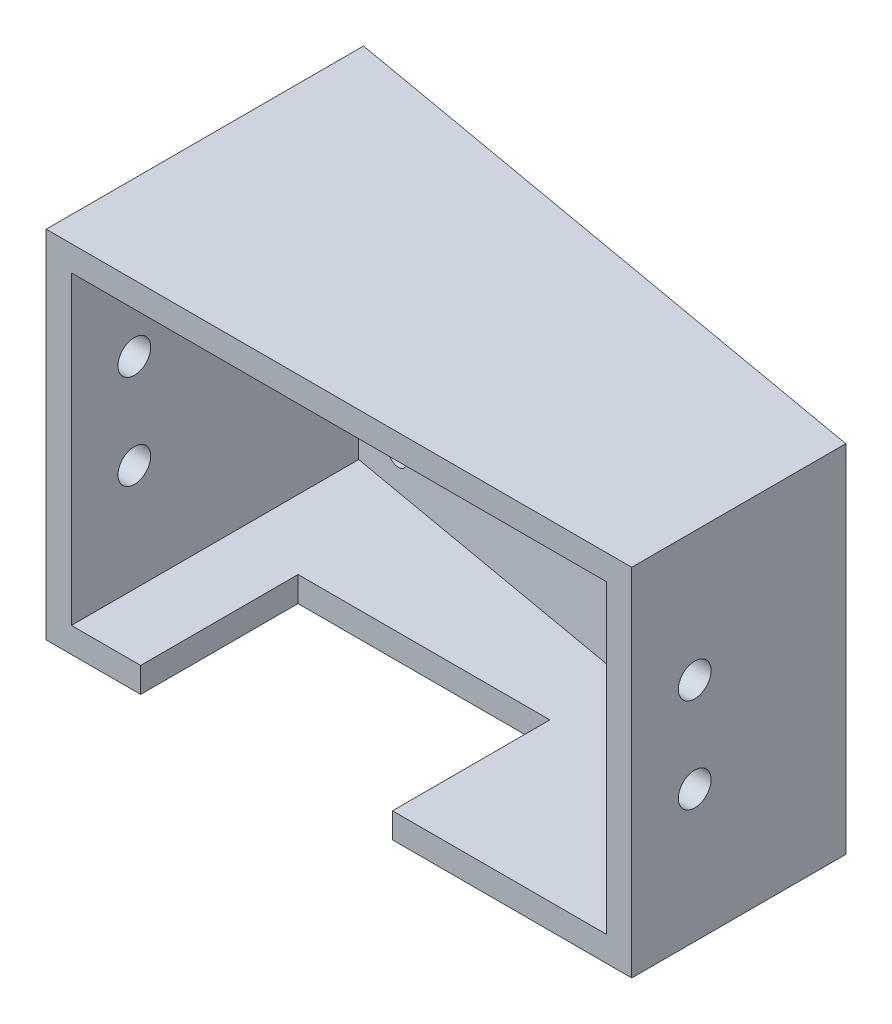
ISO-10303-21;
HEADER;
FILE_DESCRIPTION(('STEP AP214'),'2;1');
FILE_NAME('part.step','',(''),(''),'','','');
FILE_SCHEMA(('AUTOMOTIVE_DESIGN { 1 0 10303 214 1 1 1 1 }'));
ENDSEC;
DATA;
#1=APPLICATION_CONTEXT('core data for automotive mechanical design processes');
#2=APPLICATION_PROTOCOL_DEFINITION('international standard','automotive_design',2000,#1);
#3=PRODUCT_CONTEXT('',#1,'mechanical');
#4=PRODUCT('Part','Part','',(#3));
#5=PRODUCT_RELATED_PRODUCT_CATEGORY('part','',(#4));
#6=PRODUCT_DEFINITION_FORMATION('','',#4);
#7=PRODUCT_DEFINITION_CONTEXT('part definition',#1,'design');
#8=PRODUCT_DEFINITION('design','',#6,#7);
#9=PRODUCT_DEFINITION_SHAPE('','',#8);
#10=(LENGTH_UNIT() NAMED_UNIT(*) SI_UNIT(.MILLI.,.METRE.));
#11=(NAMED_UNIT(*) PLANE_ANGLE_UNIT() SI_UNIT($,.RADIAN.));
#12=(NAMED_UNIT(*) SI_UNIT($,.STERADIAN.) SOLID_ANGLE_UNIT());
#13=UNCERTAINTY_MEASURE_WITH_UNIT(LENGTH_MEASURE(1.E-05),#10,'distance_accuracy_value','');
#14=(GEOMETRIC_REPRESENTATION_CONTEXT(3) GLOBAL_UNCERTAINTY_ASSIGNED_CONTEXT((#13)) GLOBAL_UNIT_ASSIGNED_CONTEXT((#10,
#11,#12)) REPRESENTATION_CONTEXT('',''));
#15=CARTESIAN_POINT('',(0.,0.,0.));
#16=DIRECTION('',(0.,0.,1.));
#17=DIRECTION('',(1.,0.,0.));
#18=AXIS2_PLACEMENT_3D('',#15,#16,#17);
#19=CARTESIAN_POINT('',(0.,0.,0.));
#20=DIRECTION('',(0.,1.,0.));
#21=DIRECTION('',(0.,0.,1.));
#22=AXIS2_PLACEMENT_3D('',#19,#20,#21);
#23=PLANE('',#22);
#24=DIRECTION('',(0.,0.,1.));
#25=VECTOR('',#24,1.);
#26=CARTESIAN_POINT('',(5.08,0.,-5.08000000000001));
#27=LINE('',#26,#25);
#28=CARTESIAN_POINT('',(5.08,0.,-57.9518714410982));
#29=VERTEX_POINT('',#28);
#30=CARTESIAN_POINT('',(5.08,0.,0.));
#31=VERTEX_POINT('',#30);
#32=EDGE_CURVE('E56',#29,#31,#27,.T.);
#33=ORIENTED_EDGE('',*,*,#32,.F.);
#34=DIRECTION('',(-0.984807753012208,0.,-0.173648177666931));
#35=VECTOR('',#34,1.);
#36=CARTESIAN_POINT('',(5.08,0.,-57.9518714410982));
#37=LINE('',#36,#35);
#38=CARTESIAN_POINT('',(113.03,0.,-38.9173738736194));
#39=VERTEX_POINT('',#38);
#40=EDGE_CURVE('E201',#39,#29,#37,.T.);
#41=ORIENTED_EDGE('',*,*,#40,.F.);
#42=DIRECTION('',(0.,0.,-1.));
#43=VECTOR('',#42,1.);
#44=CARTESIAN_POINT('',(113.03,0.,-38.9173738736194));
#45=LINE('',#44,#43);
#46=CARTESIAN_POINT('',(113.03,0.,0.));
#47=VERTEX_POINT('',#46);
#48=EDGE_CURVE('E61',#47,#39,#45,.T.);
#49=ORIENTED_EDGE('',*,*,#48,.F.);
#50=DIRECTION('',(1.,0.,0.));
#51=VECTOR('',#50,1.);
#52=CARTESIAN_POINT('',(0.,0.,0.));
#53=LINE('',#52,#51);
#54=EDGE_CURVE('E215',#31,#47,#53,.T.);
#55=ORIENTED_EDGE('',*,*,#54,.F.);
#56=EDGE_LOOP('',(#33,#41,#49,#55));
#57=FACE_BOUND('',#56,.T.);
#58=ADVANCED_FACE('F39',(#57),#23,.F.);
#59=CARTESIAN_POINT('',(10.9456671738894,5.08,-62.0759632468652));
#60=DIRECTION('',(0.173648177666931,0.,-0.984807753012208));
#61=DIRECTION('',(-0.984807753012208,0.,-0.173648177666931));
#62=AXIS2_PLACEMENT_3D('',#59,#60,#61);
#63=PLANE('',#62);
#64=CARTESIAN_POINT('',(102.829704621393,-6.985,-45.8743283484434));
#65=DIRECTION('',(0.173648177666931,0.,-0.984807753012208));
#66=DIRECTION('',(0.984807753012208,0.,0.173648177666931));
#67=AXIS2_PLACEMENT_3D('',#64,#65,#66);
#68=CIRCLE('',#67,2.667);
#69=CARTESIAN_POINT('',(105.456186898676,-6.985,-45.4112086586057));
#70=VERTEX_POINT('',#69);
#71=EDGE_CURVE('E546',#70,#70,#68,.T.);
#72=ORIENTED_EDGE('',*,*,#71,.F.);
#73=EDGE_LOOP('',(#72));
#74=FACE_BOUND('',#73,.T.);
#75=CARTESIAN_POINT('',(15.2802953786074,-54.61,-61.3116513430335));
#76=DIRECTION('',(0.173648177666931,0.,-0.984807753012208));
#77=DIRECTION('',(0.984807753012208,0.,0.173648177666931));
#78=AXIS2_PLACEMENT_3D('',#75,#76,#77);
#79=CIRCLE('',#78,2.667);
#80=CARTESIAN_POINT('',(17.9067776558909,-54.61,-60.8485316531958));
#81=VERTEX_POINT('',#80);
#82=EDGE_CURVE('E551',#81,#81,#79,.T.);
#83=ORIENTED_EDGE('',*,*,#82,.F.);
#84=EDGE_LOOP('',(#83));
#85=FACE_BOUND('',#84,.T.);
#86=CARTESIAN_POINT('',(102.829704621393,-54.61,-45.8743283484434));
#87=DIRECTION('',(0.173648177666931,0.,-0.984807753012208));
#88=DIRECTION('',(-0.984807753012208,0.,-0.173648177666931));
#89=AXIS2_PLACEMENT_3D('',#86,#87,#88);
#90=CIRCLE('',#89,2.667);
#91=CARTESIAN_POINT('',(100.203222344109,-54.61,-46.3374480382811));
#92=VERTEX_POINT('',#91);
#93=EDGE_CURVE('E587',#92,#92,#90,.T.);
#94=ORIENTED_EDGE('',*,*,#93,.F.);
#95=EDGE_LOOP('',(#94));
#96=FACE_BOUND('',#95,.T.);
#97=CARTESIAN_POINT('',(15.2802953786074,-6.985,-61.3116513430335));
#98=DIRECTION('',(0.173648177666931,0.,-0.984807753012208));
#99=DIRECTION('',(-0.984807753012208,0.,-0.173648177666931));
#100=AXIS2_PLACEMENT_3D('',#97,#98,#99);
#101=CIRCLE('',#100,2.667);
#102=CARTESIAN_POINT('',(12.6538131013238,-6.985,-61.7747710328712));
#103=VERTEX_POINT('',#102);
#104=EDGE_CURVE('E244',#103,#103,#101,.T.);
#105=ORIENTED_EDGE('',*,*,#104,.F.);
#106=EDGE_LOOP('',(#105));
#107=FACE_BOUND('',#106,.T.);
#108=DIRECTION('',(0.,-1.,0.));
#109=VECTOR('',#108,1.);
#110=CARTESIAN_POINT('',(118.11,5.08,-43.18));
#111=LINE('',#110,#109);
#112=CARTESIAN_POINT('',(118.11,5.08,-43.18));
#113=VERTEX_POINT('',#112);
#114=CARTESIAN_POINT('',(118.11,-66.675,-43.18));
#115=VERTEX_POINT('',#114);
#116=EDGE_CURVE('E224',#113,#115,#111,.T.);
#117=ORIENTED_EDGE('',*,*,#116,.T.);
#118=DIRECTION('',(0.984807753012208,0.,0.173648177666931));
#119=VECTOR('',#118,1.);
#120=CARTESIAN_POINT('',(10.9456671738894,-66.675,-62.0759632468652));
#121=LINE('',#120,#119);
#122=CARTESIAN_POINT('',(0.,-66.675,-64.0059796914768));
#123=VERTEX_POINT('',#122);
#124=EDGE_CURVE('E146',#123,#115,#121,.T.);
#125=ORIENTED_EDGE('',*,*,#124,.F.);
#126=DIRECTION('',(0.,-1.,0.));
#127=VECTOR('',#126,1.);
#128=CARTESIAN_POINT('',(0.,5.08,-64.0059796914768));
#129=LINE('',#128,#127);
#130=CARTESIAN_POINT('',(0.,5.08,-64.0059796914768));
#131=VERTEX_POINT('',#130);
#132=EDGE_CURVE('E11',#131,#123,#129,.T.);
#133=ORIENTED_EDGE('',*,*,#132,.F.);
#134=DIRECTION('',(0.984807753012208,0.,0.173648177666931));
#135=VECTOR('',#134,1.);
#136=CARTESIAN_POINT('',(10.9456671738894,5.08,-62.0759632468652));
#137=LINE('',#136,#135);
#138=EDGE_CURVE('E216',#131,#113,#137,.T.);
#139=ORIENTED_EDGE('',*,*,#138,.T.);
#140=EDGE_LOOP('',(#117,#125,#133,#139));
#141=FACE_BOUND('',#140,.T.);
#142=ADVANCED_FACE('F41',(#74,#85,#96,#107,#141),#63,.T.);
#143=CARTESIAN_POINT('',(0.,5.08,0.));
#144=DIRECTION('',(-1.,0.,0.));
#145=DIRECTION('',(0.,0.,1.));
#146=AXIS2_PLACEMENT_3D('',#143,#144,#145);
#147=PLANE('',#146);
#148=CARTESIAN_POINT('',(0.,-20.955,-12.7));
#149=DIRECTION('',(-1.,0.,0.));
#150=DIRECTION('',(0.,0.,1.));
#151=AXIS2_PLACEMENT_3D('',#148,#149,#150);
#152=CIRCLE('',#151,3.302);
#153=CARTESIAN_POINT('',(0.,-20.955,-9.398));
#154=VERTEX_POINT('',#153);
#155=EDGE_CURVE('E236',#154,#154,#152,.T.);
#156=ORIENTED_EDGE('',*,*,#155,.F.);
#157=EDGE_LOOP('',(#156));
#158=FACE_BOUND('',#157,.T.);
#159=CARTESIAN_POINT('',(0.,-40.005,-12.6999999999998));
#160=DIRECTION('',(-1.,0.,0.));
#161=DIRECTION('',(0.,0.,1.));
#162=AXIS2_PLACEMENT_3D('',#159,#160,#161);
#163=CIRCLE('',#162,3.302);
#164=CARTESIAN_POINT('',(0.,-40.005,-9.3979999999998));
#165=VERTEX_POINT('',#164);
#166=EDGE_CURVE('E249',#165,#165,#163,.T.);
#167=ORIENTED_EDGE('',*,*,#166,.F.);
#168=EDGE_LOOP('',(#167));
#169=FACE_BOUND('',#168,.T.);
#170=ORIENTED_EDGE('',*,*,#132,.T.);
#171=DIRECTION('',(0.,0.,-1.));
#172=VECTOR('',#171,1.);
#173=CARTESIAN_POINT('',(0.,-66.675,0.));
#174=LINE('',#173,#172);
#175=CARTESIAN_POINT('',(0.,-66.675,0.));
#176=VERTEX_POINT('',#175);
#177=EDGE_CURVE('E141',#176,#123,#174,.T.);
#178=ORIENTED_EDGE('',*,*,#177,.F.);
#179=DIRECTION('',(0.,-1.,0.));
#180=VECTOR('',#179,1.);
#181=CARTESIAN_POINT('',(0.,5.08,0.));
#182=LINE('',#181,#180);
#183=CARTESIAN_POINT('',(0.,5.08,0.));
#184=VERTEX_POINT('',#183);
#185=EDGE_CURVE('E48',#184,#176,#182,.T.);
#186=ORIENTED_EDGE('',*,*,#185,.F.);
#187=DIRECTION('',(0.,0.,-1.));
#188=VECTOR('',#187,1.);
#189=CARTESIAN_POINT('',(0.,5.08,0.));
#190=LINE('',#189,#188);
#191=EDGE_CURVE('E219',#184,#131,#190,.T.);
#192=ORIENTED_EDGE('',*,*,#191,.T.);
#193=EDGE_LOOP('',(#170,#178,#186,#192));
#194=FACE_BOUND('',#193,.T.);
#195=ADVANCED_FACE('F142',(#158,#169,#194),#147,.T.);
#196=CARTESIAN_POINT('',(0.,5.08,0.));
#197=DIRECTION('',(0.,0.,-1.));
#198=DIRECTION('',(-1.,0.,0.));
#199=AXIS2_PLACEMENT_3D('',#196,#197,#198);
#200=PLANE('',#199);
#201=ORIENTED_EDGE('',*,*,#185,.T.);
#202=DIRECTION('',(-1.,0.,0.));
#203=VECTOR('',#202,1.);
#204=CARTESIAN_POINT('',(0.,-66.675,0.));
#205=LINE('',#204,#203);
#206=CARTESIAN_POINT('',(19.05,-66.675,0.));
#207=VERTEX_POINT('',#206);
#208=EDGE_CURVE('E132',#207,#176,#205,.T.);
#209=ORIENTED_EDGE('',*,*,#208,.F.);
#210=DIRECTION('',(0.,1.,0.));
#211=VECTOR('',#210,1.);
#212=CARTESIAN_POINT('',(19.05,-66.675,0.));
#213=LINE('',#212,#211);
#214=CARTESIAN_POINT('',(19.05,-61.595,0.));
#215=VERTEX_POINT('',#214);
#216=EDGE_CURVE('E171',#207,#215,#213,.T.);
#217=ORIENTED_EDGE('',*,*,#216,.T.);
#218=DIRECTION('',(-1.,0.,0.));
#219=VECTOR('',#218,1.);
#220=CARTESIAN_POINT('',(0.,-61.595,0.));
#221=LINE('',#220,#219);
#222=CARTESIAN_POINT('',(5.08,-61.595,0.));
#223=VERTEX_POINT('',#222);
#224=EDGE_CURVE('E172',#215,#223,#221,.T.);
#225=ORIENTED_EDGE('',*,*,#224,.T.);
#226=DIRECTION('',(0.,1.,0.));
#227=VECTOR('',#226,1.);
#228=CARTESIAN_POINT('',(5.08,-61.595,0.));
#229=LINE('',#228,#227);
#230=EDGE_CURVE('E199',#223,#31,#229,.T.);
#231=ORIENTED_EDGE('',*,*,#230,.T.);
#232=ORIENTED_EDGE('',*,*,#54,.T.);
#233=DIRECTION('',(0.,1.,0.));
#234=VECTOR('',#233,1.);
#235=CARTESIAN_POINT('',(113.03,-61.595,0.));
#236=LINE('',#235,#234);
#237=CARTESIAN_POINT('',(113.03,-61.595,0.));
#238=VERTEX_POINT('',#237);
#239=EDGE_CURVE('E212',#238,#47,#236,.T.);
#240=ORIENTED_EDGE('',*,*,#239,.F.);
#241=CARTESIAN_POINT('',(69.85,-61.595,0.));
#242=VERTEX_POINT('',#241);
#243=EDGE_CURVE('E175',#238,#242,#221,.T.);
#244=ORIENTED_EDGE('',*,*,#243,.T.);
#245=DIRECTION('',(0.,1.,0.));
#246=VECTOR('',#245,1.);
#247=CARTESIAN_POINT('',(69.85,-66.675,0.));
#248=LINE('',#247,#246);
#249=CARTESIAN_POINT('',(69.85,-66.675,0.));
#250=VERTEX_POINT('',#249);
#251=EDGE_CURVE('E187',#250,#242,#248,.T.);
#252=ORIENTED_EDGE('',*,*,#251,.F.);
#253=CARTESIAN_POINT('',(118.11,-66.675,0.));
#254=VERTEX_POINT('',#253);
#255=EDGE_CURVE('E154',#254,#250,#205,.T.);
#256=ORIENTED_EDGE('',*,*,#255,.F.);
#257=DIRECTION('',(0.,-1.,0.));
#258=VECTOR('',#257,1.);
#259=CARTESIAN_POINT('',(118.11,5.08,0.));
#260=LINE('',#259,#258);
#261=CARTESIAN_POINT('',(118.11,5.08,0.));
#262=VERTEX_POINT('',#261);
#263=EDGE_CURVE('E138',#262,#254,#260,.T.);
#264=ORIENTED_EDGE('',*,*,#263,.F.);
#265=DIRECTION('',(1.,0.,0.));
#266=VECTOR('',#265,1.);
#267=CARTESIAN_POINT('',(0.,5.08,0.));
#268=LINE('',#267,#266);
#269=EDGE_CURVE('E134',#184,#262,#268,.T.);
#270=ORIENTED_EDGE('',*,*,#269,.F.);
#271=EDGE_LOOP('',(#201,#209,#217,#225,#231,#232,#240,#244,#252,#256,#264,#270));
#272=FACE_BOUND('',#271,.T.);
#273=ADVANCED_FACE('F129',(#272),#200,.F.);
#274=CARTESIAN_POINT('',(118.11,5.08,0.));
#275=DIRECTION('',(-1.,0.,0.));
#276=DIRECTION('',(0.,0.,1.));
#277=AXIS2_PLACEMENT_3D('',#274,#275,#276);
#278=PLANE('',#277);
#279=CARTESIAN_POINT('',(118.11,-20.955,-12.7));
#280=DIRECTION('',(-1.,0.,0.));
#281=DIRECTION('',(0.,0.,1.));
#282=AXIS2_PLACEMENT_3D('',#279,#280,#281);
#283=CIRCLE('',#282,3.302);
#284=CARTESIAN_POINT('',(118.11,-20.955,-9.398));
#285=VERTEX_POINT('',#284);
#286=EDGE_CURVE('E230',#285,#285,#283,.T.);
#287=ORIENTED_EDGE('',*,*,#286,.T.);
#288=EDGE_LOOP('',(#287));
#289=FACE_BOUND('',#288,.T.);
#290=CARTESIAN_POINT('',(118.11,-40.005,-12.6999999999998));
#291=DIRECTION('',(-1.,0.,0.));
#292=DIRECTION('',(0.,0.,1.));
#293=AXIS2_PLACEMENT_3D('',#290,#291,#292);
#294=CIRCLE('',#293,3.302);
#295=CARTESIAN_POINT('',(118.11,-40.005,-9.3979999999998));
#296=VERTEX_POINT('',#295);
#297=EDGE_CURVE('E241',#296,#296,#294,.T.);
#298=ORIENTED_EDGE('',*,*,#297,.T.);
#299=EDGE_LOOP('',(#298));
#300=FACE_BOUND('',#299,.T.);
#301=ORIENTED_EDGE('',*,*,#263,.T.);
#302=DIRECTION('',(0.,0.,1.));
#303=VECTOR('',#302,1.);
#304=CARTESIAN_POINT('',(118.11,-66.675,0.));
#305=LINE('',#304,#303);
#306=EDGE_CURVE('E159',#115,#254,#305,.T.);
#307=ORIENTED_EDGE('',*,*,#306,.F.);
#308=ORIENTED_EDGE('',*,*,#116,.F.);
#309=DIRECTION('',(0.,0.,-1.));
#310=VECTOR('',#309,1.);
#311=CARTESIAN_POINT('',(118.11,5.08,0.));
#312=LINE('',#311,#310);
#313=EDGE_CURVE('E222',#262,#113,#312,.T.);
#314=ORIENTED_EDGE('',*,*,#313,.F.);
#315=EDGE_LOOP('',(#301,#307,#308,#314));
#316=FACE_BOUND('',#315,.T.);
#317=ADVANCED_FACE('F288',(#289,#300,#316),#278,.F.);
#318=CARTESIAN_POINT('',(0.,5.08,0.));
#319=DIRECTION('',(0.,1.,0.));
#320=DIRECTION('',(0.,0.,1.));
#321=AXIS2_PLACEMENT_3D('',#318,#319,#320);
#322=PLANE('',#321);
#323=ORIENTED_EDGE('',*,*,#138,.F.);
#324=ORIENTED_EDGE('',*,*,#191,.F.);
#325=ORIENTED_EDGE('',*,*,#269,.T.);
#326=ORIENTED_EDGE('',*,*,#313,.T.);
#327=EDGE_LOOP('',(#323,#324,#325,#326));
#328=FACE_BOUND('',#327,.T.);
#329=ADVANCED_FACE('F286',(#328),#322,.T.);
#330=CARTESIAN_POINT('',(113.03,-61.595,-38.9173738736194));
#331=DIRECTION('',(1.,0.,0.));
#332=DIRECTION('',(0.,0.,-1.));
#333=AXIS2_PLACEMENT_3D('',#330,#331,#332);
#334=PLANE('',#333);
#335=CARTESIAN_POINT('',(113.03,-20.955,-12.7));
#336=DIRECTION('',(1.,0.,0.));
#337=DIRECTION('',(0.,0.,-1.));
#338=AXIS2_PLACEMENT_3D('',#335,#336,#337);
#339=CIRCLE('',#338,3.302);
#340=CARTESIAN_POINT('',(113.03,-20.955,-16.002));
#341=VERTEX_POINT('',#340);
#342=EDGE_CURVE('E176',#341,#341,#339,.T.);
#343=ORIENTED_EDGE('',*,*,#342,.T.);
#344=EDGE_LOOP('',(#343));
#345=FACE_BOUND('',#344,.T.);
#346=CARTESIAN_POINT('',(113.03,-40.005,-12.6999999999998));
#347=DIRECTION('',(1.,0.,0.));
#348=DIRECTION('',(0.,0.,-1.));
#349=AXIS2_PLACEMENT_3D('',#346,#347,#348);
#350=CIRCLE('',#349,3.302);
#351=CARTESIAN_POINT('',(113.03,-40.005,-16.0019999999998));
#352=VERTEX_POINT('',#351);
#353=EDGE_CURVE('E229',#352,#352,#350,.T.);
#354=ORIENTED_EDGE('',*,*,#353,.T.);
#355=EDGE_LOOP('',(#354));
#356=FACE_BOUND('',#355,.T.);
#357=ORIENTED_EDGE('',*,*,#48,.T.);
#358=DIRECTION('',(0.,1.,0.));
#359=VECTOR('',#358,1.);
#360=CARTESIAN_POINT('',(113.03,-61.595,-38.9173738736194));
#361=LINE('',#360,#359);
#362=CARTESIAN_POINT('',(113.03,-61.595,-38.9173738736194));
#363=VERTEX_POINT('',#362);
#364=EDGE_CURVE('E209',#363,#39,#361,.T.);
#365=ORIENTED_EDGE('',*,*,#364,.F.);
#366=DIRECTION('',(0.,0.,-1.));
#367=VECTOR('',#366,1.);
#368=CARTESIAN_POINT('',(113.03,-61.595,-5.08));
#369=LINE('',#368,#367);
#370=EDGE_CURVE('E190',#238,#363,#369,.T.);
#371=ORIENTED_EDGE('',*,*,#370,.F.);
#372=ORIENTED_EDGE('',*,*,#239,.T.);
#373=EDGE_LOOP('',(#357,#365,#371,#372));
#374=FACE_BOUND('',#373,.T.);
#375=ADVANCED_FACE('F319',(#345,#356,#374),#334,.F.);
#376=CARTESIAN_POINT('',(5.08,-61.595,-57.9518714410982));
#377=DIRECTION('',(0.173648177666931,0.,-0.984807753012208));
#378=DIRECTION('',(-0.984807753012208,0.,-0.173648177666931));
#379=AXIS2_PLACEMENT_3D('',#376,#377,#378);
#380=PLANE('',#379);
#381=CARTESIAN_POINT('',(101.947571878845,-6.985,-40.8715049631414));
#382=DIRECTION('',(0.173648177666931,0.,-0.984807753012208));
#383=DIRECTION('',(0.984807753012208,0.,0.173648177666931));
#384=AXIS2_PLACEMENT_3D('',#381,#382,#383);
#385=CIRCLE('',#384,2.667);
#386=CARTESIAN_POINT('',(104.574054156128,-6.985,-40.4083852733037));
#387=VERTEX_POINT('',#386);
#388=EDGE_CURVE('E543',#387,#387,#385,.T.);
#389=ORIENTED_EDGE('',*,*,#388,.T.);
#390=EDGE_LOOP('',(#389));
#391=FACE_BOUND('',#390,.T.);
#392=CARTESIAN_POINT('',(14.3981626360594,-54.61,-56.3088279577315));
#393=DIRECTION('',(0.173648177666931,0.,-0.984807753012208));
#394=DIRECTION('',(0.984807753012208,0.,0.173648177666931));
#395=AXIS2_PLACEMENT_3D('',#392,#393,#394);
#396=CIRCLE('',#395,2.667);
#397=CARTESIAN_POINT('',(17.0246449133429,-54.61,-55.8457082678938));
#398=VERTEX_POINT('',#397);
#399=EDGE_CURVE('E547',#398,#398,#396,.T.);
#400=ORIENTED_EDGE('',*,*,#399,.T.);
#401=EDGE_LOOP('',(#400));
#402=FACE_BOUND('',#401,.T.);
#403=CARTESIAN_POINT('',(101.947571878845,-54.61,-40.8715049631414));
#404=DIRECTION('',(0.173648177666931,0.,-0.984807753012208));
#405=DIRECTION('',(-0.984807753012208,0.,-0.173648177666931));
#406=AXIS2_PLACEMENT_3D('',#403,#404,#405);
#407=CIRCLE('',#406,2.667);
#408=CARTESIAN_POINT('',(99.3210896015611,-54.61,-41.3346246529791));
#409=VERTEX_POINT('',#408);
#410=EDGE_CURVE('E556',#409,#409,#407,.T.);
#411=ORIENTED_EDGE('',*,*,#410,.T.);
#412=EDGE_LOOP('',(#411));
#413=FACE_BOUND('',#412,.T.);
#414=CARTESIAN_POINT('',(14.3981626360594,-6.985,-56.3088279577315));
#415=DIRECTION('',(0.173648177666931,0.,-0.984807753012208));
#416=DIRECTION('',(-0.984807753012208,0.,-0.173648177666931));
#417=AXIS2_PLACEMENT_3D('',#414,#415,#416);
#418=CIRCLE('',#417,2.667);
#419=CARTESIAN_POINT('',(11.7716803587758,-6.985,-56.7719476475692));
#420=VERTEX_POINT('',#419);
#421=EDGE_CURVE('E251',#420,#420,#418,.T.);
#422=ORIENTED_EDGE('',*,*,#421,.T.);
#423=EDGE_LOOP('',(#422));
#424=FACE_BOUND('',#423,.T.);
#425=ORIENTED_EDGE('',*,*,#40,.T.);
#426=DIRECTION('',(0.,1.,0.));
#427=VECTOR('',#426,1.);
#428=CARTESIAN_POINT('',(5.08,-61.595,-57.9518714410982));
#429=LINE('',#428,#427);
#430=CARTESIAN_POINT('',(5.08,-61.595,-57.9518714410982));
#431=VERTEX_POINT('',#430);
#432=EDGE_CURVE('E206',#431,#29,#429,.T.);
#433=ORIENTED_EDGE('',*,*,#432,.F.);
#434=DIRECTION('',(-0.984807753012208,0.,-0.173648177666931));
#435=VECTOR('',#434,1.);
#436=CARTESIAN_POINT('',(5.08,-61.595,-57.9518714410982));
#437=LINE('',#436,#435);
#438=EDGE_CURVE('E193',#363,#431,#437,.T.);
#439=ORIENTED_EDGE('',*,*,#438,.F.);
#440=ORIENTED_EDGE('',*,*,#364,.T.);
#441=EDGE_LOOP('',(#425,#433,#439,#440));
#442=FACE_BOUND('',#441,.T.);
#443=ADVANCED_FACE('F325',(#391,#402,#413,#424,#442),#380,.F.);
#444=CARTESIAN_POINT('',(5.08,-61.595,-5.08000000000001));
#445=DIRECTION('',(-1.,0.,0.));
#446=DIRECTION('',(0.,0.,1.));
#447=AXIS2_PLACEMENT_3D('',#444,#445,#446);
#448=PLANE('',#447);
#449=CARTESIAN_POINT('',(5.08,-20.955,-12.7));
#450=DIRECTION('',(-1.,0.,0.));
#451=DIRECTION('',(0.,0.,1.));
#452=AXIS2_PLACEMENT_3D('',#449,#450,#451);
#453=CIRCLE('',#452,3.302);
#454=CARTESIAN_POINT('',(5.08,-20.955,-9.398));
#455=VERTEX_POINT('',#454);
#456=EDGE_CURVE('E43',#455,#455,#453,.T.);
#457=ORIENTED_EDGE('',*,*,#456,.T.);
#458=EDGE_LOOP('',(#457));
#459=FACE_BOUND('',#458,.T.);
#460=CARTESIAN_POINT('',(5.08,-40.005,-12.6999999999998));
#461=DIRECTION('',(-1.,0.,0.));
#462=DIRECTION('',(0.,0.,1.));
#463=AXIS2_PLACEMENT_3D('',#460,#461,#462);
#464=CIRCLE('',#463,3.302);
#465=CARTESIAN_POINT('',(5.08,-40.005,-9.3979999999998));
#466=VERTEX_POINT('',#465);
#467=EDGE_CURVE('E227',#466,#466,#464,.T.);
#468=ORIENTED_EDGE('',*,*,#467,.T.);
#469=EDGE_LOOP('',(#468));
#470=FACE_BOUND('',#469,.T.);
#471=ORIENTED_EDGE('',*,*,#32,.T.);
#472=ORIENTED_EDGE('',*,*,#230,.F.);
#473=DIRECTION('',(0.,0.,1.));
#474=VECTOR('',#473,1.);
#475=CARTESIAN_POINT('',(5.08,-61.595,-5.08000000000001));
#476=LINE('',#475,#474);
#477=EDGE_CURVE('E196',#431,#223,#476,.T.);
#478=ORIENTED_EDGE('',*,*,#477,.F.);
#479=ORIENTED_EDGE('',*,*,#432,.T.);
#480=EDGE_LOOP('',(#471,#472,#478,#479));
#481=FACE_BOUND('',#480,.T.);
#482=ADVANCED_FACE('F258',(#459,#470,#481),#448,.F.);
#483=CARTESIAN_POINT('',(0.,-61.595,0.));
#484=DIRECTION('',(0.,-1.,0.));
#485=DIRECTION('',(0.,0.,-1.));
#486=AXIS2_PLACEMENT_3D('',#483,#484,#485);
#487=PLANE('',#486);
#488=ORIENTED_EDGE('',*,*,#243,.F.);
#489=ORIENTED_EDGE('',*,*,#370,.T.);
#490=ORIENTED_EDGE('',*,*,#438,.T.);
#491=ORIENTED_EDGE('',*,*,#477,.T.);
#492=ORIENTED_EDGE('',*,*,#224,.F.);
#493=DIRECTION('',(0.,0.,1.));
#494=VECTOR('',#493,1.);
#495=CARTESIAN_POINT('',(19.05,-61.595,0.));
#496=LINE('',#495,#494);
#497=CARTESIAN_POINT('',(19.05,-61.595,-31.75));
#498=VERTEX_POINT('',#497);
#499=EDGE_CURVE('E152',#498,#215,#496,.T.);
#500=ORIENTED_EDGE('',*,*,#499,.F.);
#501=DIRECTION('',(-1.,0.,0.));
#502=VECTOR('',#501,1.);
#503=CARTESIAN_POINT('',(0.,-61.595,-31.75));
#504=LINE('',#503,#502);
#505=CARTESIAN_POINT('',(69.85,-61.595,-31.75));
#506=VERTEX_POINT('',#505);
#507=EDGE_CURVE('E155',#506,#498,#504,.T.);
#508=ORIENTED_EDGE('',*,*,#507,.F.);
#509=DIRECTION('',(0.,0.,-1.));
#510=VECTOR('',#509,1.);
#511=CARTESIAN_POINT('',(69.85,-61.595,0.));
#512=LINE('',#511,#510);
#513=EDGE_CURVE('E177',#242,#506,#512,.T.);
#514=ORIENTED_EDGE('',*,*,#513,.F.);
#515=EDGE_LOOP('',(#488,#489,#490,#491,#492,#500,#508,#514));
#516=FACE_BOUND('',#515,.T.);
#517=ADVANCED_FACE('F339',(#516),#487,.F.);
#518=CARTESIAN_POINT('',(69.85,-66.675,0.));
#519=DIRECTION('',(1.,0.,0.));
#520=DIRECTION('',(0.,0.,-1.));
#521=AXIS2_PLACEMENT_3D('',#518,#519,#520);
#522=PLANE('',#521);
#523=ORIENTED_EDGE('',*,*,#513,.T.);
#524=DIRECTION('',(0.,1.,0.));
#525=VECTOR('',#524,1.);
#526=CARTESIAN_POINT('',(69.85,-66.675,-31.75));
#527=LINE('',#526,#525);
#528=CARTESIAN_POINT('',(69.85,-66.675,-31.75));
#529=VERTEX_POINT('',#528);
#530=EDGE_CURVE('E184',#529,#506,#527,.T.);
#531=ORIENTED_EDGE('',*,*,#530,.F.);
#532=DIRECTION('',(0.,0.,-1.));
#533=VECTOR('',#532,1.);
#534=CARTESIAN_POINT('',(69.85,-66.675,0.));
#535=LINE('',#534,#533);
#536=EDGE_CURVE('E158',#250,#529,#535,.T.);
#537=ORIENTED_EDGE('',*,*,#536,.F.);
#538=ORIENTED_EDGE('',*,*,#251,.T.);
#539=EDGE_LOOP('',(#523,#531,#537,#538));
#540=FACE_BOUND('',#539,.T.);
#541=ADVANCED_FACE('F346',(#540),#522,.F.);
#542=CARTESIAN_POINT('',(0.,-66.675,-31.75));
#543=DIRECTION('',(0.,0.,-1.));
#544=DIRECTION('',(-1.,0.,0.));
#545=AXIS2_PLACEMENT_3D('',#542,#543,#544);
#546=PLANE('',#545);
#547=ORIENTED_EDGE('',*,*,#507,.T.);
#548=DIRECTION('',(0.,1.,0.));
#549=VECTOR('',#548,1.);
#550=CARTESIAN_POINT('',(19.05,-66.675,-31.75));
#551=LINE('',#550,#549);
#552=CARTESIAN_POINT('',(19.05,-66.675,-31.75));
#553=VERTEX_POINT('',#552);
#554=EDGE_CURVE('E181',#553,#498,#551,.T.);
#555=ORIENTED_EDGE('',*,*,#554,.F.);
#556=DIRECTION('',(-1.,0.,0.));
#557=VECTOR('',#556,1.);
#558=CARTESIAN_POINT('',(0.,-66.675,-31.75));
#559=LINE('',#558,#557);
#560=EDGE_CURVE('E163',#529,#553,#559,.T.);
#561=ORIENTED_EDGE('',*,*,#560,.F.);
#562=ORIENTED_EDGE('',*,*,#530,.T.);
#563=EDGE_LOOP('',(#547,#555,#561,#562));
#564=FACE_BOUND('',#563,.T.);
#565=ADVANCED_FACE('F354',(#564),#546,.F.);
#566=CARTESIAN_POINT('',(19.05,-66.675,0.));
#567=DIRECTION('',(-1.,0.,0.));
#568=DIRECTION('',(0.,0.,1.));
#569=AXIS2_PLACEMENT_3D('',#566,#567,#568);
#570=PLANE('',#569);
#571=ORIENTED_EDGE('',*,*,#499,.T.);
#572=ORIENTED_EDGE('',*,*,#216,.F.);
#573=DIRECTION('',(0.,0.,1.));
#574=VECTOR('',#573,1.);
#575=CARTESIAN_POINT('',(19.05,-66.675,0.));
#576=LINE('',#575,#574);
#577=EDGE_CURVE('E150',#553,#207,#576,.T.);
#578=ORIENTED_EDGE('',*,*,#577,.F.);
#579=ORIENTED_EDGE('',*,*,#554,.T.);
#580=EDGE_LOOP('',(#571,#572,#578,#579));
#581=FACE_BOUND('',#580,.T.);
#582=ADVANCED_FACE('F362',(#581),#570,.F.);
#583=CARTESIAN_POINT('',(0.,-66.675,0.));
#584=DIRECTION('',(0.,-1.,0.));
#585=DIRECTION('',(0.,0.,-1.));
#586=AXIS2_PLACEMENT_3D('',#583,#584,#585);
#587=PLANE('',#586);
#588=ORIENTED_EDGE('',*,*,#208,.T.);
#589=ORIENTED_EDGE('',*,*,#177,.T.);
#590=ORIENTED_EDGE('',*,*,#124,.T.);
#591=ORIENTED_EDGE('',*,*,#306,.T.);
#592=ORIENTED_EDGE('',*,*,#255,.T.);
#593=ORIENTED_EDGE('',*,*,#536,.T.);
#594=ORIENTED_EDGE('',*,*,#560,.T.);
#595=ORIENTED_EDGE('',*,*,#577,.T.);
#596=EDGE_LOOP('',(#588,#589,#590,#591,#592,#593,#594,#595));
#597=FACE_BOUND('',#596,.T.);
#598=ADVANCED_FACE('F148',(#597),#587,.T.);
#599=CARTESIAN_POINT('',(118.11,-40.005,-12.6999999999998));
#600=DIRECTION('',(-1.,0.,0.));
#601=DIRECTION('',(0.,0.,1.));
#602=AXIS2_PLACEMENT_3D('',#599,#600,#601);
#603=CYLINDRICAL_SURFACE('',#602,3.302);
#604=ORIENTED_EDGE('',*,*,#166,.T.);
#605=EDGE_LOOP('',(#604));
#606=FACE_BOUND('',#605,.T.);
#607=ORIENTED_EDGE('',*,*,#467,.F.);
#608=EDGE_LOOP('',(#607));
#609=FACE_BOUND('',#608,.T.);
#610=ADVANCED_FACE('F263',(#606,#609),#603,.F.);
#611=CARTESIAN_POINT('',(118.11,-20.955,-12.7));
#612=DIRECTION('',(-1.,0.,0.));
#613=DIRECTION('',(0.,0.,1.));
#614=AXIS2_PLACEMENT_3D('',#611,#612,#613);
#615=CYLINDRICAL_SURFACE('',#614,3.302);
#616=ORIENTED_EDGE('',*,*,#155,.T.);
#617=EDGE_LOOP('',(#616));
#618=FACE_BOUND('',#617,.T.);
#619=ORIENTED_EDGE('',*,*,#456,.F.);
#620=EDGE_LOOP('',(#619));
#621=FACE_BOUND('',#620,.T.);
#622=ADVANCED_FACE('F260',(#618,#621),#615,.F.);
#623=ORIENTED_EDGE('',*,*,#297,.F.);
#624=EDGE_LOOP('',(#623));
#625=FACE_BOUND('',#624,.T.);
#626=ORIENTED_EDGE('',*,*,#353,.F.);
#627=EDGE_LOOP('',(#626));
#628=FACE_BOUND('',#627,.T.);
#629=ADVANCED_FACE('F262',(#625,#628),#603,.F.);
#630=ORIENTED_EDGE('',*,*,#286,.F.);
#631=EDGE_LOOP('',(#630));
#632=FACE_BOUND('',#631,.T.);
#633=ORIENTED_EDGE('',*,*,#342,.F.);
#634=EDGE_LOOP('',(#633));
#635=FACE_BOUND('',#634,.T.);
#636=ADVANCED_FACE('F266',(#632,#635),#615,.F.);
#637=CARTESIAN_POINT('',(14.3981626360594,-6.985,-56.3088279577315));
#638=DIRECTION('',(0.173648177666931,0.,-0.984807753012208));
#639=DIRECTION('',(-0.984807753012208,0.,-0.173648177666931));
#640=AXIS2_PLACEMENT_3D('',#637,#638,#639);
#641=CYLINDRICAL_SURFACE('',#640,2.667);
#642=ORIENTED_EDGE('',*,*,#421,.F.);
#643=EDGE_LOOP('',(#642));
#644=FACE_BOUND('',#643,.T.);
#645=ORIENTED_EDGE('',*,*,#104,.T.);
#646=EDGE_LOOP('',(#645));
#647=FACE_BOUND('',#646,.T.);
#648=ADVANCED_FACE('F276',(#644,#647),#641,.F.);
#649=CARTESIAN_POINT('',(101.947571878845,-54.61,-40.8715049631414));
#650=DIRECTION('',(0.173648177666931,0.,-0.984807753012208));
#651=DIRECTION('',(-0.984807753012208,0.,-0.173648177666931));
#652=AXIS2_PLACEMENT_3D('',#649,#650,#651);
#653=CYLINDRICAL_SURFACE('',#652,2.667);
#654=ORIENTED_EDGE('',*,*,#410,.F.);
#655=EDGE_LOOP('',(#654));
#656=FACE_BOUND('',#655,.T.);
#657=ORIENTED_EDGE('',*,*,#93,.T.);
#658=EDGE_LOOP('',(#657));
#659=FACE_BOUND('',#658,.T.);
#660=ADVANCED_FACE('F507',(#656,#659),#653,.F.);
#661=CARTESIAN_POINT('',(14.3981626360594,-54.61,-56.3088279577315));
#662=DIRECTION('',(0.173648177666931,0.,-0.984807753012208));
#663=DIRECTION('',(-0.984807753012208,0.,-0.173648177666931));
#664=AXIS2_PLACEMENT_3D('',#661,#662,#663);
#665=CYLINDRICAL_SURFACE('',#664,2.667);
#666=ORIENTED_EDGE('',*,*,#399,.F.);
#667=EDGE_LOOP('',(#666));
#668=FACE_BOUND('',#667,.T.);
#669=ORIENTED_EDGE('',*,*,#82,.T.);
#670=EDGE_LOOP('',(#669));
#671=FACE_BOUND('',#670,.T.);
#672=ADVANCED_FACE('F513',(#668,#671),#665,.F.);
#673=CARTESIAN_POINT('',(101.947571878845,-6.985,-40.8715049631414));
#674=DIRECTION('',(0.173648177666931,0.,-0.984807753012208));
#675=DIRECTION('',(-0.984807753012208,0.,-0.173648177666931));
#676=AXIS2_PLACEMENT_3D('',#673,#674,#675);
#677=CYLINDRICAL_SURFACE('',#676,2.667);
#678=ORIENTED_EDGE('',*,*,#388,.F.);
#679=EDGE_LOOP('',(#678));
#680=FACE_BOUND('',#679,.T.);
#681=ORIENTED_EDGE('',*,*,#71,.T.);
#682=EDGE_LOOP('',(#681));
#683=FACE_BOUND('',#682,.T.);
#684=ADVANCED_FACE('F521',(#680,#683),#677,.F.);
#685=CLOSED_SHELL('',(#58,#142,#195,#273,#317,#329,#375,#443,#482,#517,#541,#565,#582,#598,#610,
#622,#629,#636,#648,#660,#672,#684));
#686=MANIFOLD_SOLID_BREP('B2',#685);
#687=ADVANCED_BREP_SHAPE_REPRESENTATION('',(#18,#686),#14);
#688=SHAPE_DEFINITION_REPRESENTATION(#9,#687);
ENDSEC;
END-ISO-10303-21;
